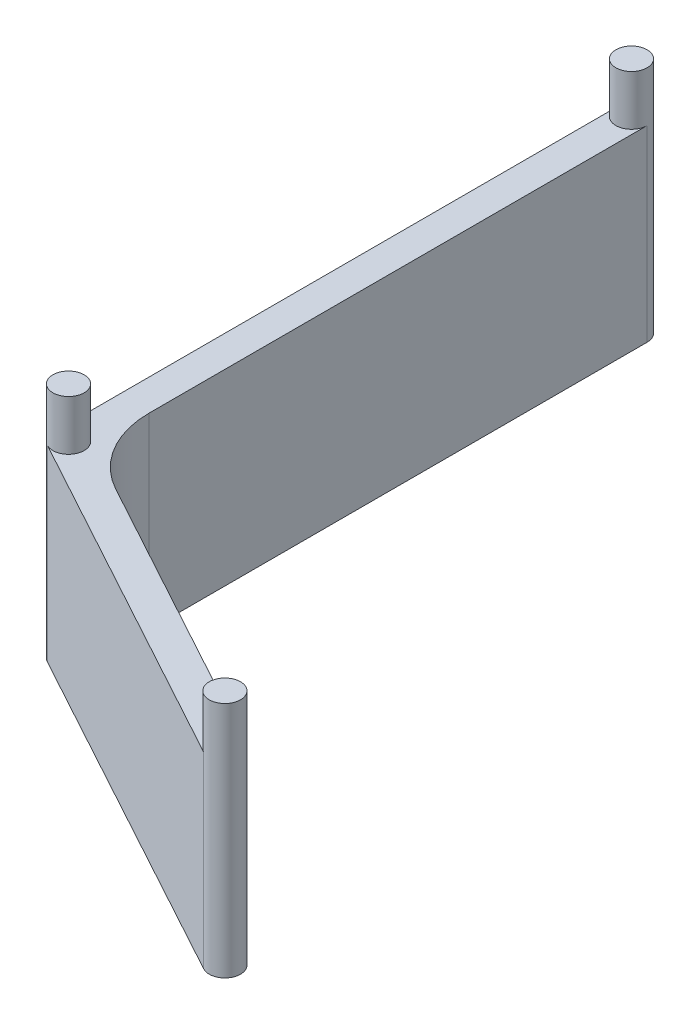
ISO-10303-21;
HEADER;
FILE_DESCRIPTION(('STEP AP214'),'2;1');
FILE_NAME('part.step','',(''),(''),'','','');
FILE_SCHEMA(('AUTOMOTIVE_DESIGN { 1 0 10303 214 1 1 1 1 }'));
ENDSEC;
DATA;
#1=APPLICATION_CONTEXT('core data for automotive mechanical design processes');
#2=APPLICATION_PROTOCOL_DEFINITION('international standard','automotive_design',2000,#1);
#3=PRODUCT_CONTEXT('',#1,'mechanical');
#4=PRODUCT('Part','Part','',(#3));
#5=PRODUCT_RELATED_PRODUCT_CATEGORY('part','',(#4));
#6=PRODUCT_DEFINITION_FORMATION('','',#4);
#7=PRODUCT_DEFINITION_CONTEXT('part definition',#1,'design');
#8=PRODUCT_DEFINITION('design','',#6,#7);
#9=PRODUCT_DEFINITION_SHAPE('','',#8);
#10=(LENGTH_UNIT() NAMED_UNIT(*) SI_UNIT(.MILLI.,.METRE.));
#11=(NAMED_UNIT(*) PLANE_ANGLE_UNIT() SI_UNIT($,.RADIAN.));
#12=(NAMED_UNIT(*) SI_UNIT($,.STERADIAN.) SOLID_ANGLE_UNIT());
#13=UNCERTAINTY_MEASURE_WITH_UNIT(LENGTH_MEASURE(1.E-05),#10,'distance_accuracy_value','');
#14=(GEOMETRIC_REPRESENTATION_CONTEXT(3) GLOBAL_UNCERTAINTY_ASSIGNED_CONTEXT((#13)) GLOBAL_UNIT_ASSIGNED_CONTEXT((#10,
#11,#12)) REPRESENTATION_CONTEXT('',''));
#15=CARTESIAN_POINT('',(0.,0.,0.));
#16=DIRECTION('',(0.,0.,1.));
#17=DIRECTION('',(1.,0.,0.));
#18=AXIS2_PLACEMENT_3D('',#15,#16,#17);
#19=CARTESIAN_POINT('',(0.,38.1,0.));
#20=DIRECTION('',(0.,-1.,0.));
#21=DIRECTION('',(0.,0.,-1.));
#22=AXIS2_PLACEMENT_3D('',#19,#20,#21);
#23=CYLINDRICAL_SURFACE('',#22,3.175);
#24=CARTESIAN_POINT('',(0.,0.,0.));
#25=DIRECTION('',(0.,1.,0.));
#26=DIRECTION('',(0.,0.,1.));
#27=AXIS2_PLACEMENT_3D('',#24,#25,#26);
#28=CIRCLE('',#27,3.175);
#29=CARTESIAN_POINT('',(-3.175,0.,0.));
#30=VERTEX_POINT('',#29);
#31=CARTESIAN_POINT('',(-1.52035551491082,0.,2.78731844400317));
#32=VERTEX_POINT('',#31);
#33=EDGE_CURVE('E151',#30,#32,#28,.T.);
#34=ORIENTED_EDGE('',*,*,#33,.T.);
#35=DIRECTION('',(0.,-1.,0.));
#36=VECTOR('',#35,1.);
#37=CARTESIAN_POINT('',(-1.52035551491082,38.1,2.78731844400317));
#38=LINE('',#37,#36);
#39=CARTESIAN_POINT('',(-1.52035551491082,38.1,2.78731844400317));
#40=VERTEX_POINT('',#39);
#41=EDGE_CURVE('E193',#40,#32,#38,.T.);
#42=ORIENTED_EDGE('',*,*,#41,.F.);
#43=CARTESIAN_POINT('',(0.,38.1,0.));
#44=DIRECTION('',(0.,1.,0.));
#45=DIRECTION('',(0.,0.,1.));
#46=AXIS2_PLACEMENT_3D('',#43,#44,#45);
#47=CIRCLE('',#46,3.175);
#48=CARTESIAN_POINT('',(-3.175,38.1,0.));
#49=VERTEX_POINT('',#48);
#50=EDGE_CURVE('E135',#40,#49,#47,.T.);
#51=ORIENTED_EDGE('',*,*,#50,.T.);
#52=DIRECTION('',(0.,-1.,0.));
#53=VECTOR('',#52,1.);
#54=CARTESIAN_POINT('',(-3.175,38.1,0.));
#55=LINE('',#54,#53);
#56=EDGE_CURVE('E161',#49,#30,#55,.T.);
#57=ORIENTED_EDGE('',*,*,#56,.T.);
#58=EDGE_LOOP('',(#34,#42,#51,#57));
#59=FACE_BOUND('',#58,.T.);
#60=CARTESIAN_POINT('',(0.,48.26,0.));
#61=DIRECTION('',(0.,-1.,0.));
#62=DIRECTION('',(0.,0.,-1.));
#63=AXIS2_PLACEMENT_3D('',#60,#61,#62);
#64=CIRCLE('',#63,3.175);
#65=CARTESIAN_POINT('',(0.,48.26,-3.175));
#66=VERTEX_POINT('',#65);
#67=EDGE_CURVE('E129',#66,#66,#64,.T.);
#68=ORIENTED_EDGE('',*,*,#67,.T.);
#69=EDGE_LOOP('',(#68));
#70=FACE_BOUND('',#69,.T.);
#71=ADVANCED_FACE('F39',(#59,#70),#23,.T.);
#72=CARTESIAN_POINT('',(-1.52035551491082,38.1,2.78731844400317));
#73=DIRECTION('',(0.478852130680573,0.,-0.877895572914384));
#74=DIRECTION('',(-0.877895572914384,0.,-0.478852130680573));
#75=AXIS2_PLACEMENT_3D('',#72,#73,#74);
#76=PLANE('',#75);
#77=DIRECTION('',(0.877895572914384,0.,0.478852130680573));
#78=VECTOR('',#77,1.);
#79=CARTESIAN_POINT('',(-1.52035551491082,0.,2.78731844400317));
#80=LINE('',#79,#78);
#81=CARTESIAN_POINT('',(68.3296444850892,0.,40.8873184440032));
#82=VERTEX_POINT('',#81);
#83=EDGE_CURVE('E165',#32,#82,#80,.T.);
#84=ORIENTED_EDGE('',*,*,#83,.T.);
#85=DIRECTION('',(0.,-1.,0.));
#86=VECTOR('',#85,1.);
#87=CARTESIAN_POINT('',(68.3296444850892,38.1,40.8873184440032));
#88=LINE('',#87,#86);
#89=CARTESIAN_POINT('',(68.3296444850892,38.1,40.8873184440032));
#90=VERTEX_POINT('',#89);
#91=EDGE_CURVE('E122',#90,#82,#88,.T.);
#92=ORIENTED_EDGE('',*,*,#91,.F.);
#93=DIRECTION('',(0.877895572914384,0.,0.478852130680573));
#94=VECTOR('',#93,1.);
#95=CARTESIAN_POINT('',(-1.52035551491082,38.1,2.78731844400317));
#96=LINE('',#95,#94);
#97=EDGE_CURVE('E111',#40,#90,#96,.T.);
#98=ORIENTED_EDGE('',*,*,#97,.F.);
#99=ORIENTED_EDGE('',*,*,#41,.T.);
#100=EDGE_LOOP('',(#84,#92,#98,#99));
#101=FACE_BOUND('',#100,.T.);
#102=ADVANCED_FACE('F224',(#101),#76,.F.);
#103=CARTESIAN_POINT('',(69.85,38.1,38.1));
#104=DIRECTION('',(0.,-1.,0.));
#105=DIRECTION('',(0.,0.,-1.));
#106=AXIS2_PLACEMENT_3D('',#103,#104,#105);
#107=CYLINDRICAL_SURFACE('',#106,3.175);
#108=CARTESIAN_POINT('',(69.85,0.,38.1));
#109=DIRECTION('',(0.,1.,0.));
#110=DIRECTION('',(0.,0.,1.));
#111=AXIS2_PLACEMENT_3D('',#108,#109,#110);
#112=CIRCLE('',#111,3.175);
#113=CARTESIAN_POINT('',(71.3703555149108,0.,35.3126815559968));
#114=VERTEX_POINT('',#113);
#115=EDGE_CURVE('E120',#82,#114,#112,.T.);
#116=ORIENTED_EDGE('',*,*,#115,.T.);
#117=DIRECTION('',(0.,-1.,0.));
#118=VECTOR('',#117,1.);
#119=CARTESIAN_POINT('',(71.3703555149108,38.1,35.3126815559968));
#120=LINE('',#119,#118);
#121=CARTESIAN_POINT('',(71.3703555149108,38.1,35.3126815559968));
#122=VERTEX_POINT('',#121);
#123=EDGE_CURVE('E105',#122,#114,#120,.T.);
#124=ORIENTED_EDGE('',*,*,#123,.F.);
#125=CARTESIAN_POINT('',(69.85,38.1,38.1));
#126=DIRECTION('',(0.,1.,0.));
#127=DIRECTION('',(0.,0.,1.));
#128=AXIS2_PLACEMENT_3D('',#125,#126,#127);
#129=CIRCLE('',#128,3.175);
#130=EDGE_CURVE('E118',#122,#90,#129,.T.);
#131=ORIENTED_EDGE('',*,*,#130,.T.);
#132=ORIENTED_EDGE('',*,*,#91,.T.);
#133=EDGE_LOOP('',(#116,#124,#131,#132));
#134=FACE_BOUND('',#133,.T.);
#135=CARTESIAN_POINT('',(69.85,48.26,38.1));
#136=DIRECTION('',(0.,-1.,0.));
#137=DIRECTION('',(0.,0.,-1.));
#138=AXIS2_PLACEMENT_3D('',#135,#136,#137);
#139=CIRCLE('',#138,3.175);
#140=CARTESIAN_POINT('',(69.85,48.26,34.925));
#141=VERTEX_POINT('',#140);
#142=EDGE_CURVE('E130',#141,#141,#139,.T.);
#143=ORIENTED_EDGE('',*,*,#142,.T.);
#144=EDGE_LOOP('',(#143));
#145=FACE_BOUND('',#144,.T.);
#146=ADVANCED_FACE('F115',(#134,#145),#107,.T.);
#147=CARTESIAN_POINT('',(3.175,38.1,-1.88478508849998));
#148=DIRECTION('',(-0.478852130680573,0.,0.877895572914384));
#149=DIRECTION('',(0.877895572914384,0.,0.478852130680573));
#150=AXIS2_PLACEMENT_3D('',#147,#148,#149);
#151=PLANE('',#150);
#152=DIRECTION('',(-0.877895572914384,0.,-0.478852130680573));
#153=VECTOR('',#152,1.);
#154=CARTESIAN_POINT('',(3.175,0.,-1.88478508849998));
#155=LINE('',#154,#153);
#156=CARTESIAN_POINT('',(13.1028669105351,0.,3.53041504451916));
#157=VERTEX_POINT('',#156);
#158=EDGE_CURVE('E170',#114,#157,#155,.T.);
#159=ORIENTED_EDGE('',*,*,#158,.T.);
#160=DIRECTION('',(0.,-1.,0.));
#161=VECTOR('',#160,1.);
#162=CARTESIAN_POINT('',(13.1028669105351,38.1,3.53041504451916));
#163=LINE('',#162,#161);
#164=CARTESIAN_POINT('',(13.1028669105351,38.1,3.53041504451916));
#165=VERTEX_POINT('',#164);
#166=EDGE_CURVE('E55',#157,#165,#163,.F.);
#167=ORIENTED_EDGE('',*,*,#166,.T.);
#168=DIRECTION('',(-0.877895572914384,0.,-0.478852130680573));
#169=VECTOR('',#168,1.);
#170=CARTESIAN_POINT('',(3.175,38.1,-1.88478508849998));
#171=LINE('',#170,#169);
#172=EDGE_CURVE('E102',#122,#165,#171,.T.);
#173=ORIENTED_EDGE('',*,*,#172,.F.);
#174=ORIENTED_EDGE('',*,*,#123,.T.);
#175=EDGE_LOOP('',(#159,#167,#173,#174));
#176=FACE_BOUND('',#175,.T.);
#177=ADVANCED_FACE('F104',(#176),#151,.F.);
#178=CARTESIAN_POINT('',(3.175,38.1,-1.88478508849998));
#179=DIRECTION('',(-1.,0.,0.));
#180=DIRECTION('',(0.,0.,1.));
#181=AXIS2_PLACEMENT_3D('',#178,#179,#180);
#182=PLANE('',#181);
#183=DIRECTION('',(0.,0.,-1.));
#184=VECTOR('',#183,1.);
#185=CARTESIAN_POINT('',(3.175,38.1,-1.88478508849998));
#186=LINE('',#185,#184);
#187=CARTESIAN_POINT('',(3.175,38.1,-13.1934956194999));
#188=VERTEX_POINT('',#187);
#189=CARTESIAN_POINT('',(3.175,38.1,-114.3));
#190=VERTEX_POINT('',#189);
#191=EDGE_CURVE('E110',#188,#190,#186,.T.);
#192=ORIENTED_EDGE('',*,*,#191,.F.);
#193=DIRECTION('',(0.,-1.,0.));
#194=VECTOR('',#193,1.);
#195=CARTESIAN_POINT('',(3.17500000000001,0.,-13.1934956194999));
#196=LINE('',#195,#194);
#197=CARTESIAN_POINT('',(3.175,0.,-13.1934956194999));
#198=VERTEX_POINT('',#197);
#199=EDGE_CURVE('E197',#188,#198,#196,.T.);
#200=ORIENTED_EDGE('',*,*,#199,.T.);
#201=DIRECTION('',(0.,0.,-1.));
#202=VECTOR('',#201,1.);
#203=CARTESIAN_POINT('',(3.175,0.,-1.88478508849998));
#204=LINE('',#203,#202);
#205=CARTESIAN_POINT('',(3.175,0.,-114.3));
#206=VERTEX_POINT('',#205);
#207=EDGE_CURVE('E173',#198,#206,#204,.T.);
#208=ORIENTED_EDGE('',*,*,#207,.T.);
#209=DIRECTION('',(0.,-1.,0.));
#210=VECTOR('',#209,1.);
#211=CARTESIAN_POINT('',(3.175,38.1,-114.3));
#212=LINE('',#211,#210);
#213=EDGE_CURVE('E123',#190,#206,#212,.T.);
#214=ORIENTED_EDGE('',*,*,#213,.F.);
#215=EDGE_LOOP('',(#192,#200,#208,#214));
#216=FACE_BOUND('',#215,.T.);
#217=ADVANCED_FACE('F206',(#216),#182,.F.);
#218=CARTESIAN_POINT('',(0.,38.1,-114.3));
#219=DIRECTION('',(0.,-1.,0.));
#220=DIRECTION('',(0.,0.,-1.));
#221=AXIS2_PLACEMENT_3D('',#218,#219,#220);
#222=CYLINDRICAL_SURFACE('',#221,3.175);
#223=CARTESIAN_POINT('',(0.,0.,-114.3));
#224=DIRECTION('',(0.,1.,0.));
#225=DIRECTION('',(0.,0.,1.));
#226=AXIS2_PLACEMENT_3D('',#223,#224,#225);
#227=CIRCLE('',#226,3.175);
#228=CARTESIAN_POINT('',(-3.175,0.,-114.3));
#229=VERTEX_POINT('',#228);
#230=EDGE_CURVE('E176',#206,#229,#227,.T.);
#231=ORIENTED_EDGE('',*,*,#230,.T.);
#232=DIRECTION('',(0.,-1.,0.));
#233=VECTOR('',#232,1.);
#234=CARTESIAN_POINT('',(-3.175,38.1,-114.3));
#235=LINE('',#234,#233);
#236=CARTESIAN_POINT('',(-3.175,38.1,-114.3));
#237=VERTEX_POINT('',#236);
#238=EDGE_CURVE('E184',#237,#229,#235,.T.);
#239=ORIENTED_EDGE('',*,*,#238,.F.);
#240=CARTESIAN_POINT('',(0.,38.1,-114.3));
#241=DIRECTION('',(0.,1.,0.));
#242=DIRECTION('',(0.,0.,1.));
#243=AXIS2_PLACEMENT_3D('',#240,#241,#242);
#244=CIRCLE('',#243,3.175);
#245=EDGE_CURVE('E147',#237,#190,#244,.T.);
#246=ORIENTED_EDGE('',*,*,#245,.T.);
#247=ORIENTED_EDGE('',*,*,#213,.T.);
#248=EDGE_LOOP('',(#231,#239,#246,#247));
#249=FACE_BOUND('',#248,.T.);
#250=CARTESIAN_POINT('',(0.,48.26,-114.3));
#251=DIRECTION('',(0.,-1.,0.));
#252=DIRECTION('',(0.,0.,-1.));
#253=AXIS2_PLACEMENT_3D('',#250,#251,#252);
#254=CIRCLE('',#253,3.175);
#255=CARTESIAN_POINT('',(0.,48.26,-117.475));
#256=VERTEX_POINT('',#255);
#257=EDGE_CURVE('E143',#256,#256,#254,.T.);
#258=ORIENTED_EDGE('',*,*,#257,.T.);
#259=EDGE_LOOP('',(#258));
#260=FACE_BOUND('',#259,.T.);
#261=ADVANCED_FACE('F215',(#249,#260),#222,.T.);
#262=CARTESIAN_POINT('',(-3.175,38.1,0.));
#263=DIRECTION('',(1.,0.,0.));
#264=DIRECTION('',(0.,0.,-1.));
#265=AXIS2_PLACEMENT_3D('',#262,#263,#264);
#266=PLANE('',#265);
#267=DIRECTION('',(0.,0.,1.));
#268=VECTOR('',#267,1.);
#269=CARTESIAN_POINT('',(-3.175,0.,0.));
#270=LINE('',#269,#268);
#271=EDGE_CURVE('E153',#229,#30,#270,.T.);
#272=ORIENTED_EDGE('',*,*,#271,.T.);
#273=ORIENTED_EDGE('',*,*,#56,.F.);
#274=DIRECTION('',(0.,0.,1.));
#275=VECTOR('',#274,1.);
#276=CARTESIAN_POINT('',(-3.175,38.1,0.));
#277=LINE('',#276,#275);
#278=EDGE_CURVE('E157',#237,#49,#277,.T.);
#279=ORIENTED_EDGE('',*,*,#278,.F.);
#280=ORIENTED_EDGE('',*,*,#238,.T.);
#281=EDGE_LOOP('',(#272,#273,#279,#280));
#282=FACE_BOUND('',#281,.T.);
#283=ADVANCED_FACE('F219',(#282),#266,.F.);
#284=CARTESIAN_POINT('',(0.,38.1,0.));
#285=DIRECTION('',(0.,1.,0.));
#286=DIRECTION('',(0.,0.,1.));
#287=AXIS2_PLACEMENT_3D('',#284,#285,#286);
#288=PLANE('',#287);
#289=ORIENTED_EDGE('',*,*,#130,.F.);
#290=ORIENTED_EDGE('',*,*,#172,.T.);
#291=CARTESIAN_POINT('',(22.225,38.1,-13.1934956194999));
#292=DIRECTION('',(0.,1.,0.));
#293=DIRECTION('',(0.,0.,1.));
#294=AXIS2_PLACEMENT_3D('',#291,#292,#293);
#295=CIRCLE('',#294,19.05);
#296=EDGE_CURVE('E11',#165,#188,#295,.F.);
#297=ORIENTED_EDGE('',*,*,#296,.T.);
#298=ORIENTED_EDGE('',*,*,#191,.T.);
#299=ORIENTED_EDGE('',*,*,#245,.F.);
#300=ORIENTED_EDGE('',*,*,#278,.T.);
#301=ORIENTED_EDGE('',*,*,#50,.F.);
#302=ORIENTED_EDGE('',*,*,#97,.T.);
#303=EDGE_LOOP('',(#289,#290,#297,#298,#299,#300,#301,#302));
#304=FACE_BOUND('',#303,.T.);
#305=ADVANCED_FACE('F125',(#304),#288,.T.);
#306=CARTESIAN_POINT('',(0.,0.,0.));
#307=DIRECTION('',(0.,1.,0.));
#308=DIRECTION('',(0.,0.,1.));
#309=AXIS2_PLACEMENT_3D('',#306,#307,#308);
#310=PLANE('',#309);
#311=ORIENTED_EDGE('',*,*,#158,.F.);
#312=ORIENTED_EDGE('',*,*,#115,.F.);
#313=ORIENTED_EDGE('',*,*,#83,.F.);
#314=ORIENTED_EDGE('',*,*,#33,.F.);
#315=ORIENTED_EDGE('',*,*,#271,.F.);
#316=ORIENTED_EDGE('',*,*,#230,.F.);
#317=ORIENTED_EDGE('',*,*,#207,.F.);
#318=CARTESIAN_POINT('',(22.225,0.,-13.1934956194999));
#319=DIRECTION('',(0.,1.,0.));
#320=DIRECTION('',(0.,0.,1.));
#321=AXIS2_PLACEMENT_3D('',#318,#319,#320);
#322=CIRCLE('',#321,19.05);
#323=EDGE_CURVE('E48',#198,#157,#322,.T.);
#324=ORIENTED_EDGE('',*,*,#323,.T.);
#325=EDGE_LOOP('',(#311,#312,#313,#314,#315,#316,#317,#324));
#326=FACE_BOUND('',#325,.T.);
#327=ADVANCED_FACE('F210',(#326),#310,.F.);
#328=CARTESIAN_POINT('',(0.,48.26,-114.3));
#329=DIRECTION('',(0.,-1.,0.));
#330=DIRECTION('',(0.,0.,-1.));
#331=AXIS2_PLACEMENT_3D('',#328,#329,#330);
#332=PLANE('',#331);
#333=ORIENTED_EDGE('',*,*,#257,.F.);
#334=EDGE_LOOP('',(#333));
#335=FACE_BOUND('',#334,.T.);
#336=ADVANCED_FACE('F251',(#335),#332,.F.);
#337=CARTESIAN_POINT('',(0.,48.26,0.));
#338=DIRECTION('',(0.,-1.,0.));
#339=DIRECTION('',(0.,0.,-1.));
#340=AXIS2_PLACEMENT_3D('',#337,#338,#339);
#341=PLANE('',#340);
#342=ORIENTED_EDGE('',*,*,#67,.F.);
#343=EDGE_LOOP('',(#342));
#344=FACE_BOUND('',#343,.T.);
#345=ADVANCED_FACE('F230',(#344),#341,.F.);
#346=CARTESIAN_POINT('',(69.85,48.26,38.1));
#347=DIRECTION('',(0.,-1.,0.));
#348=DIRECTION('',(0.,0.,-1.));
#349=AXIS2_PLACEMENT_3D('',#346,#347,#348);
#350=PLANE('',#349);
#351=ORIENTED_EDGE('',*,*,#142,.F.);
#352=EDGE_LOOP('',(#351));
#353=FACE_BOUND('',#352,.T.);
#354=ADVANCED_FACE('F226',(#353),#350,.F.);
#355=CARTESIAN_POINT('',(22.225,38.1,-13.1934956194999));
#356=DIRECTION('',(0.,1.,0.));
#357=DIRECTION('',(0.,0.,1.));
#358=AXIS2_PLACEMENT_3D('',#355,#356,#357);
#359=CYLINDRICAL_SURFACE('',#358,19.05);
#360=ORIENTED_EDGE('',*,*,#296,.F.);
#361=ORIENTED_EDGE('',*,*,#166,.F.);
#362=ORIENTED_EDGE('',*,*,#323,.F.);
#363=ORIENTED_EDGE('',*,*,#199,.F.);
#364=EDGE_LOOP('',(#360,#361,#362,#363));
#365=FACE_BOUND('',#364,.T.);
#366=ADVANCED_FACE('F41',(#365),#359,.F.);
#367=CLOSED_SHELL('',(#71,#102,#146,#177,#217,#261,#283,#305,#327,#336,#345,#354,#366));
#368=MANIFOLD_SOLID_BREP('B2',#367);
#369=ADVANCED_BREP_SHAPE_REPRESENTATION('',(#18,#368),#14);
#370=SHAPE_DEFINITION_REPRESENTATION(#9,#369);
ENDSEC;
END-ISO-10303-21;
